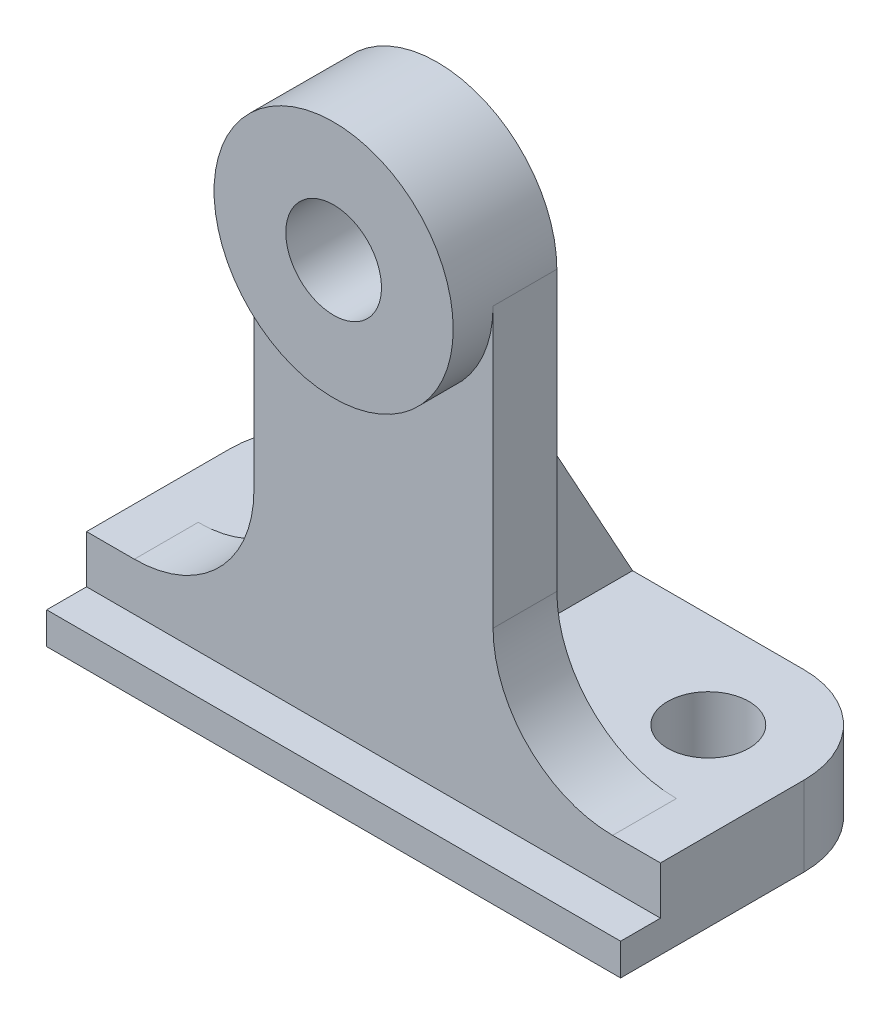
ISO-10303-21;
HEADER;
FILE_DESCRIPTION(('STEP AP214'),'2;1');
FILE_NAME('part.step','',(''),(''),'','','');
FILE_SCHEMA(('AUTOMOTIVE_DESIGN { 1 0 10303 214 1 1 1 1 }'));
ENDSEC;
DATA;
#1=APPLICATION_CONTEXT('core data for automotive mechanical design processes');
#2=APPLICATION_PROTOCOL_DEFINITION('international standard','automotive_design',2000,#1);
#3=PRODUCT_CONTEXT('',#1,'mechanical');
#4=PRODUCT('Part','Part','',(#3));
#5=PRODUCT_RELATED_PRODUCT_CATEGORY('part','',(#4));
#6=PRODUCT_DEFINITION_FORMATION('','',#4);
#7=PRODUCT_DEFINITION_CONTEXT('part definition',#1,'design');
#8=PRODUCT_DEFINITION('design','',#6,#7);
#9=PRODUCT_DEFINITION_SHAPE('','',#8);
#10=(LENGTH_UNIT() NAMED_UNIT(*) SI_UNIT(.MILLI.,.METRE.));
#11=(NAMED_UNIT(*) PLANE_ANGLE_UNIT() SI_UNIT($,.RADIAN.));
#12=(NAMED_UNIT(*) SI_UNIT($,.STERADIAN.) SOLID_ANGLE_UNIT());
#13=UNCERTAINTY_MEASURE_WITH_UNIT(LENGTH_MEASURE(1.E-05),#10,'distance_accuracy_value','');
#14=(GEOMETRIC_REPRESENTATION_CONTEXT(3) GLOBAL_UNCERTAINTY_ASSIGNED_CONTEXT((#13)) GLOBAL_UNIT_ASSIGNED_CONTEXT((#10,
#11,#12)) REPRESENTATION_CONTEXT('',''));
#15=CARTESIAN_POINT('',(0.,0.,0.));
#16=DIRECTION('',(0.,0.,1.));
#17=DIRECTION('',(1.,0.,0.));
#18=AXIS2_PLACEMENT_3D('',#15,#16,#17);
#19=CARTESIAN_POINT('',(0.,10.,8.));
#20=DIRECTION('',(0.,-1.,0.));
#21=DIRECTION('',(0.,0.,-1.));
#22=AXIS2_PLACEMENT_3D('',#19,#20,#21);
#23=PLANE('',#22);
#24=CARTESIAN_POINT('',(-24.,10.,-10.));
#25=DIRECTION('',(0.,1.,0.));
#26=DIRECTION('',(0.,0.,1.));
#27=AXIS2_PLACEMENT_3D('',#24,#25,#26);
#28=CIRCLE('',#27,5.1);
#29=CARTESIAN_POINT('',(-24.,10.,-4.9));
#30=VERTEX_POINT('',#29);
#31=EDGE_CURVE('E228',#30,#30,#28,.T.);
#32=ORIENTED_EDGE('',*,*,#31,.F.);
#33=EDGE_LOOP('',(#32));
#34=FACE_BOUND('',#33,.T.);
#35=DIRECTION('',(0.,0.,-1.));
#36=VECTOR('',#35,1.);
#37=CARTESIAN_POINT('',(-2.5,10.,0.));
#38=LINE('',#37,#36);
#39=CARTESIAN_POINT('',(-2.5,10.,0.));
#40=VERTEX_POINT('',#39);
#41=CARTESIAN_POINT('',(-2.5,10.,-22.));
#42=VERTEX_POINT('',#41);
#43=EDGE_CURVE('E81',#40,#42,#38,.T.);
#44=ORIENTED_EDGE('',*,*,#43,.T.);
#45=DIRECTION('',(1.,0.,0.));
#46=VECTOR('',#45,1.);
#47=CARTESIAN_POINT('',(36.,10.,-22.));
#48=LINE('',#47,#46);
#49=CARTESIAN_POINT('',(-23.9999999999999,10.,-22.));
#50=VERTEX_POINT('',#49);
#51=EDGE_CURVE('E253',#50,#42,#48,.T.);
#52=ORIENTED_EDGE('',*,*,#51,.F.);
#53=CARTESIAN_POINT('',(-24.,10.,-10.));
#54=DIRECTION('',(0.,1.,0.));
#55=DIRECTION('',(0.,0.,1.));
#56=AXIS2_PLACEMENT_3D('',#53,#54,#55);
#57=CIRCLE('',#56,12.);
#58=CARTESIAN_POINT('',(-36.,10.,-9.99999999999991));
#59=VERTEX_POINT('',#58);
#60=EDGE_CURVE('E223',#50,#59,#57,.T.);
#61=ORIENTED_EDGE('',*,*,#60,.T.);
#62=DIRECTION('',(0.,0.,-1.));
#63=VECTOR('',#62,1.);
#64=CARTESIAN_POINT('',(-36.,10.,8.));
#65=LINE('',#64,#63);
#66=CARTESIAN_POINT('',(-36.,10.,8.));
#67=VERTEX_POINT('',#66);
#68=EDGE_CURVE('E323',#67,#59,#65,.T.);
#69=ORIENTED_EDGE('',*,*,#68,.F.);
#70=DIRECTION('',(-1.,0.,0.));
#71=VECTOR('',#70,1.);
#72=CARTESIAN_POINT('',(0.,10.,8.));
#73=LINE('',#72,#71);
#74=CARTESIAN_POINT('',(-30.0000000000001,10.,8.));
#75=VERTEX_POINT('',#74);
#76=EDGE_CURVE('E276',#75,#67,#73,.T.);
#77=ORIENTED_EDGE('',*,*,#76,.F.);
#78=DIRECTION('',(0.,0.,-1.));
#79=VECTOR('',#78,1.);
#80=CARTESIAN_POINT('',(-30.0000000000001,10.,8.));
#81=LINE('',#80,#79);
#82=CARTESIAN_POINT('',(-30.,10.,0.));
#83=VERTEX_POINT('',#82);
#84=EDGE_CURVE('E326',#75,#83,#81,.T.);
#85=ORIENTED_EDGE('',*,*,#84,.T.);
#86=DIRECTION('',(1.,0.,0.));
#87=VECTOR('',#86,1.);
#88=CARTESIAN_POINT('',(36.,10.,0.));
#89=LINE('',#88,#87);
#90=EDGE_CURVE('E256',#83,#40,#89,.T.);
#91=ORIENTED_EDGE('',*,*,#90,.T.);
#92=EDGE_LOOP('',(#44,#52,#61,#69,#77,#85,#91));
#93=FACE_BOUND('',#92,.T.);
#94=ADVANCED_FACE('F58',(#34,#93),#23,.F.);
#95=CARTESIAN_POINT('',(0.,0.,8.));
#96=DIRECTION('',(0.,0.,1.));
#97=DIRECTION('',(1.,0.,0.));
#98=AXIS2_PLACEMENT_3D('',#95,#96,#97);
#99=PLANE('',#98);
#100=DIRECTION('',(0.,-1.,0.));
#101=VECTOR('',#100,1.);
#102=CARTESIAN_POINT('',(-36.,0.,8.));
#103=LINE('',#102,#101);
#104=CARTESIAN_POINT('',(-36.,4.,8.));
#105=VERTEX_POINT('',#104);
#106=EDGE_CURVE('E278',#67,#105,#103,.T.);
#107=ORIENTED_EDGE('',*,*,#106,.T.);
#108=DIRECTION('',(-1.,0.,0.));
#109=VECTOR('',#108,1.);
#110=CARTESIAN_POINT('',(-36.,4.,8.));
#111=LINE('',#110,#109);
#112=CARTESIAN_POINT('',(36.,4.,8.));
#113=VERTEX_POINT('',#112);
#114=EDGE_CURVE('E206',#113,#105,#111,.T.);
#115=ORIENTED_EDGE('',*,*,#114,.F.);
#116=DIRECTION('',(0.,1.,0.));
#117=VECTOR('',#116,1.);
#118=CARTESIAN_POINT('',(36.,0.,8.));
#119=LINE('',#118,#117);
#120=CARTESIAN_POINT('',(36.,10.,8.));
#121=VERTEX_POINT('',#120);
#122=EDGE_CURVE('E281',#113,#121,#119,.T.);
#123=ORIENTED_EDGE('',*,*,#122,.T.);
#124=DIRECTION('',(-1.,0.,0.));
#125=VECTOR('',#124,1.);
#126=CARTESIAN_POINT('',(0.,10.,8.));
#127=LINE('',#126,#125);
#128=CARTESIAN_POINT('',(30.0000000000001,10.,8.));
#129=VERTEX_POINT('',#128);
#130=EDGE_CURVE('E283',#121,#129,#127,.T.);
#131=ORIENTED_EDGE('',*,*,#130,.T.);
#132=CARTESIAN_POINT('',(30.,25.,8.));
#133=DIRECTION('',(0.,0.,1.));
#134=DIRECTION('',(1.,0.,0.));
#135=AXIS2_PLACEMENT_3D('',#132,#133,#134);
#136=CIRCLE('',#135,15.);
#137=CARTESIAN_POINT('',(15.,25.0000000000001,8.));
#138=VERTEX_POINT('',#137);
#139=EDGE_CURVE('E285',#138,#129,#136,.T.);
#140=ORIENTED_EDGE('',*,*,#139,.F.);
#141=DIRECTION('',(0.,-1.,0.));
#142=VECTOR('',#141,1.);
#143=CARTESIAN_POINT('',(15.,0.,8.));
#144=LINE('',#143,#142);
#145=CARTESIAN_POINT('',(15.,60.,8.));
#146=VERTEX_POINT('',#145);
#147=EDGE_CURVE('E288',#146,#138,#144,.T.);
#148=ORIENTED_EDGE('',*,*,#147,.F.);
#149=CARTESIAN_POINT('',(0.,60.,8.));
#150=DIRECTION('',(0.,0.,1.));
#151=DIRECTION('',(1.,0.,0.));
#152=AXIS2_PLACEMENT_3D('',#149,#150,#151);
#153=CIRCLE('',#152,15.);
#154=CARTESIAN_POINT('',(-15.,60.,8.));
#155=VERTEX_POINT('',#154);
#156=EDGE_CURVE('E291',#155,#146,#153,.T.);
#157=ORIENTED_EDGE('',*,*,#156,.F.);
#158=DIRECTION('',(0.,-1.,0.));
#159=VECTOR('',#158,1.);
#160=CARTESIAN_POINT('',(-15.,0.,8.));
#161=LINE('',#160,#159);
#162=CARTESIAN_POINT('',(-15.,25.0000000000001,8.));
#163=VERTEX_POINT('',#162);
#164=EDGE_CURVE('E270',#155,#163,#161,.T.);
#165=ORIENTED_EDGE('',*,*,#164,.T.);
#166=CARTESIAN_POINT('',(-30.,25.,8.));
#167=DIRECTION('',(0.,0.,1.));
#168=DIRECTION('',(1.,0.,0.));
#169=AXIS2_PLACEMENT_3D('',#166,#167,#168);
#170=CIRCLE('',#169,15.);
#171=EDGE_CURVE('E273',#163,#75,#170,.F.);
#172=ORIENTED_EDGE('',*,*,#171,.T.);
#173=ORIENTED_EDGE('',*,*,#76,.T.);
#174=EDGE_LOOP('',(#107,#115,#123,#131,#140,#148,#157,#165,#172,#173));
#175=FACE_BOUND('',#174,.T.);
#176=ADVANCED_FACE('F365',(#175),#99,.T.);
#177=CARTESIAN_POINT('',(-36.,0.,8.));
#178=DIRECTION('',(1.,0.,0.));
#179=DIRECTION('',(0.,0.,-1.));
#180=AXIS2_PLACEMENT_3D('',#177,#178,#179);
#181=PLANE('',#180);
#182=DIRECTION('',(0.,1.,0.));
#183=VECTOR('',#182,1.);
#184=CARTESIAN_POINT('',(-36.,-12.,-9.99999999999991));
#185=LINE('',#184,#183);
#186=CARTESIAN_POINT('',(-36.,0.,-9.99999999999991));
#187=VERTEX_POINT('',#186);
#188=EDGE_CURVE('E226',#187,#59,#185,.T.);
#189=ORIENTED_EDGE('',*,*,#188,.F.);
#190=DIRECTION('',(0.,0.,-1.));
#191=VECTOR('',#190,1.);
#192=CARTESIAN_POINT('',(-36.,0.,8.));
#193=LINE('',#192,#191);
#194=CARTESIAN_POINT('',(-36.,0.,13.));
#195=VERTEX_POINT('',#194);
#196=EDGE_CURVE('E320',#195,#187,#193,.T.);
#197=ORIENTED_EDGE('',*,*,#196,.F.);
#198=DIRECTION('',(0.,-1.,0.));
#199=VECTOR('',#198,1.);
#200=CARTESIAN_POINT('',(-36.,0.,13.));
#201=LINE('',#200,#199);
#202=CARTESIAN_POINT('',(-36.,4.,13.));
#203=VERTEX_POINT('',#202);
#204=EDGE_CURVE('E207',#203,#195,#201,.T.);
#205=ORIENTED_EDGE('',*,*,#204,.F.);
#206=DIRECTION('',(0.,0.,-1.));
#207=VECTOR('',#206,1.);
#208=CARTESIAN_POINT('',(-36.,4.,13.));
#209=LINE('',#208,#207);
#210=EDGE_CURVE('E217',#203,#105,#209,.T.);
#211=ORIENTED_EDGE('',*,*,#210,.T.);
#212=ORIENTED_EDGE('',*,*,#106,.F.);
#213=ORIENTED_EDGE('',*,*,#68,.T.);
#214=EDGE_LOOP('',(#189,#197,#205,#211,#212,#213));
#215=FACE_BOUND('',#214,.T.);
#216=ADVANCED_FACE('F346',(#215),#181,.F.);
#217=CARTESIAN_POINT('',(0.,0.,8.));
#218=DIRECTION('',(0.,1.,0.));
#219=DIRECTION('',(0.,0.,1.));
#220=AXIS2_PLACEMENT_3D('',#217,#218,#219);
#221=PLANE('',#220);
#222=CARTESIAN_POINT('',(-24.,0.,-10.));
#223=DIRECTION('',(0.,1.,0.));
#224=DIRECTION('',(0.,0.,1.));
#225=AXIS2_PLACEMENT_3D('',#222,#223,#224);
#226=CIRCLE('',#225,5.1);
#227=CARTESIAN_POINT('',(-24.,0.,-4.9));
#228=VERTEX_POINT('',#227);
#229=EDGE_CURVE('E244',#228,#228,#226,.T.);
#230=ORIENTED_EDGE('',*,*,#229,.T.);
#231=EDGE_LOOP('',(#230));
#232=FACE_BOUND('',#231,.T.);
#233=CARTESIAN_POINT('',(-24.,0.,-10.));
#234=DIRECTION('',(0.,1.,0.));
#235=DIRECTION('',(0.,0.,1.));
#236=AXIS2_PLACEMENT_3D('',#233,#234,#235);
#237=CIRCLE('',#236,12.);
#238=CARTESIAN_POINT('',(-23.9999999999999,0.,-22.));
#239=VERTEX_POINT('',#238);
#240=EDGE_CURVE('E242',#239,#187,#237,.T.);
#241=ORIENTED_EDGE('',*,*,#240,.F.);
#242=DIRECTION('',(-1.,0.,0.));
#243=VECTOR('',#242,1.);
#244=CARTESIAN_POINT('',(36.,0.,-22.));
#245=LINE('',#244,#243);
#246=CARTESIAN_POINT('',(24.,0.,-22.));
#247=VERTEX_POINT('',#246);
#248=EDGE_CURVE('E250',#247,#239,#245,.T.);
#249=ORIENTED_EDGE('',*,*,#248,.F.);
#250=CARTESIAN_POINT('',(24.,0.,-10.));
#251=DIRECTION('',(0.,1.,0.));
#252=DIRECTION('',(0.,0.,1.));
#253=AXIS2_PLACEMENT_3D('',#250,#251,#252);
#254=CIRCLE('',#253,12.);
#255=CARTESIAN_POINT('',(36.,0.,-9.99999999999991));
#256=VERTEX_POINT('',#255);
#257=EDGE_CURVE('E239',#247,#256,#254,.F.);
#258=ORIENTED_EDGE('',*,*,#257,.T.);
#259=DIRECTION('',(0.,0.,-1.));
#260=VECTOR('',#259,1.);
#261=CARTESIAN_POINT('',(36.,0.,8.));
#262=LINE('',#261,#260);
#263=CARTESIAN_POINT('',(36.,0.,13.));
#264=VERTEX_POINT('',#263);
#265=EDGE_CURVE('E317',#264,#256,#262,.T.);
#266=ORIENTED_EDGE('',*,*,#265,.F.);
#267=DIRECTION('',(1.,0.,0.));
#268=VECTOR('',#267,1.);
#269=CARTESIAN_POINT('',(-36.,0.,13.));
#270=LINE('',#269,#268);
#271=EDGE_CURVE('E210',#195,#264,#270,.T.);
#272=ORIENTED_EDGE('',*,*,#271,.F.);
#273=ORIENTED_EDGE('',*,*,#196,.T.);
#274=EDGE_LOOP('',(#241,#249,#258,#266,#272,#273));
#275=FACE_BOUND('',#274,.T.);
#276=CARTESIAN_POINT('',(24.,0.,-10.));
#277=DIRECTION('',(0.,1.,0.));
#278=DIRECTION('',(0.,0.,1.));
#279=AXIS2_PLACEMENT_3D('',#276,#277,#278);
#280=CIRCLE('',#279,5.1);
#281=CARTESIAN_POINT('',(24.,0.,-4.9));
#282=VERTEX_POINT('',#281);
#283=EDGE_CURVE('E247',#282,#282,#280,.T.);
#284=ORIENTED_EDGE('',*,*,#283,.T.);
#285=EDGE_LOOP('',(#284));
#286=FACE_BOUND('',#285,.T.);
#287=ADVANCED_FACE('F339',(#232,#275,#286),#221,.F.);
#288=CARTESIAN_POINT('',(36.,0.,8.));
#289=DIRECTION('',(-1.,0.,0.));
#290=DIRECTION('',(0.,0.,1.));
#291=AXIS2_PLACEMENT_3D('',#288,#289,#290);
#292=PLANE('',#291);
#293=DIRECTION('',(0.,1.,0.));
#294=VECTOR('',#293,1.);
#295=CARTESIAN_POINT('',(36.,-12.,-9.99999999999991));
#296=LINE('',#295,#294);
#297=CARTESIAN_POINT('',(36.,10.,-9.99999999999991));
#298=VERTEX_POINT('',#297);
#299=EDGE_CURVE('E236',#256,#298,#296,.T.);
#300=ORIENTED_EDGE('',*,*,#299,.T.);
#301=DIRECTION('',(0.,0.,-1.));
#302=VECTOR('',#301,1.);
#303=CARTESIAN_POINT('',(36.,10.,8.));
#304=LINE('',#303,#302);
#305=EDGE_CURVE('E314',#121,#298,#304,.T.);
#306=ORIENTED_EDGE('',*,*,#305,.F.);
#307=ORIENTED_EDGE('',*,*,#122,.F.);
#308=DIRECTION('',(0.,0.,-1.));
#309=VECTOR('',#308,1.);
#310=CARTESIAN_POINT('',(36.,4.,13.));
#311=LINE('',#310,#309);
#312=CARTESIAN_POINT('',(36.,4.,13.));
#313=VERTEX_POINT('',#312);
#314=EDGE_CURVE('E221',#313,#113,#311,.T.);
#315=ORIENTED_EDGE('',*,*,#314,.F.);
#316=DIRECTION('',(0.,1.,0.));
#317=VECTOR('',#316,1.);
#318=CARTESIAN_POINT('',(36.,0.,13.));
#319=LINE('',#318,#317);
#320=EDGE_CURVE('E213',#264,#313,#319,.T.);
#321=ORIENTED_EDGE('',*,*,#320,.F.);
#322=ORIENTED_EDGE('',*,*,#265,.T.);
#323=EDGE_LOOP('',(#300,#306,#307,#315,#321,#322));
#324=FACE_BOUND('',#323,.T.);
#325=ADVANCED_FACE('F371',(#324),#292,.F.);
#326=CARTESIAN_POINT('',(2.5,10.,-22.));
#327=VERTEX_POINT('',#326);
#328=CARTESIAN_POINT('',(23.9999999999999,10.,-22.));
#329=VERTEX_POINT('',#328);
#330=EDGE_CURVE('E73',#327,#329,#48,.T.);
#331=ORIENTED_EDGE('',*,*,#330,.F.);
#332=DIRECTION('',(0.,0.,-1.));
#333=VECTOR('',#332,1.);
#334=CARTESIAN_POINT('',(2.5,10.,0.));
#335=LINE('',#334,#333);
#336=CARTESIAN_POINT('',(2.5,10.,0.));
#337=VERTEX_POINT('',#336);
#338=EDGE_CURVE('E198',#337,#327,#335,.T.);
#339=ORIENTED_EDGE('',*,*,#338,.F.);
#340=CARTESIAN_POINT('',(30.0000000000001,10.,0.));
#341=VERTEX_POINT('',#340);
#342=EDGE_CURVE('E258',#337,#341,#89,.T.);
#343=ORIENTED_EDGE('',*,*,#342,.T.);
#344=DIRECTION('',(0.,0.,-1.));
#345=VECTOR('',#344,1.);
#346=CARTESIAN_POINT('',(30.0000000000001,10.,8.));
#347=LINE('',#346,#345);
#348=EDGE_CURVE('E311',#129,#341,#347,.T.);
#349=ORIENTED_EDGE('',*,*,#348,.F.);
#350=ORIENTED_EDGE('',*,*,#130,.F.);
#351=ORIENTED_EDGE('',*,*,#305,.T.);
#352=CARTESIAN_POINT('',(24.,10.,-10.));
#353=DIRECTION('',(0.,1.,0.));
#354=DIRECTION('',(0.,0.,1.));
#355=AXIS2_PLACEMENT_3D('',#352,#353,#354);
#356=CIRCLE('',#355,12.);
#357=EDGE_CURVE('E232',#329,#298,#356,.F.);
#358=ORIENTED_EDGE('',*,*,#357,.F.);
#359=EDGE_LOOP('',(#331,#339,#343,#349,#350,#351,#358));
#360=FACE_BOUND('',#359,.T.);
#361=CARTESIAN_POINT('',(24.,10.,-10.));
#362=DIRECTION('',(0.,1.,0.));
#363=DIRECTION('',(0.,0.,1.));
#364=AXIS2_PLACEMENT_3D('',#361,#362,#363);
#365=CIRCLE('',#364,5.1);
#366=CARTESIAN_POINT('',(24.,10.,-4.9));
#367=VERTEX_POINT('',#366);
#368=EDGE_CURVE('E229',#367,#367,#365,.T.);
#369=ORIENTED_EDGE('',*,*,#368,.F.);
#370=EDGE_LOOP('',(#369));
#371=FACE_BOUND('',#370,.T.);
#372=ADVANCED_FACE('F354',(#360,#371),#23,.F.);
#373=CARTESIAN_POINT('',(0.,0.,-22.));
#374=DIRECTION('',(0.,0.,-1.));
#375=DIRECTION('',(-1.,0.,0.));
#376=AXIS2_PLACEMENT_3D('',#373,#374,#375);
#377=PLANE('',#376);
#378=ORIENTED_EDGE('',*,*,#248,.T.);
#379=DIRECTION('',(0.,1.,0.));
#380=VECTOR('',#379,1.);
#381=CARTESIAN_POINT('',(-24.,-12.,-22.));
#382=LINE('',#381,#380);
#383=EDGE_CURVE('E12',#239,#50,#382,.T.);
#384=ORIENTED_EDGE('',*,*,#383,.T.);
#385=ORIENTED_EDGE('',*,*,#51,.T.);
#386=DIRECTION('',(-1.,0.,0.));
#387=VECTOR('',#386,1.);
#388=CARTESIAN_POINT('',(2.5,10.,-22.));
#389=LINE('',#388,#387);
#390=EDGE_CURVE('E189',#327,#42,#389,.T.);
#391=ORIENTED_EDGE('',*,*,#390,.F.);
#392=ORIENTED_EDGE('',*,*,#330,.T.);
#393=DIRECTION('',(0.,1.,0.));
#394=VECTOR('',#393,1.);
#395=CARTESIAN_POINT('',(24.,-12.,-22.));
#396=LINE('',#395,#394);
#397=EDGE_CURVE('E66',#329,#247,#396,.F.);
#398=ORIENTED_EDGE('',*,*,#397,.T.);
#399=EDGE_LOOP('',(#378,#384,#385,#391,#392,#398));
#400=FACE_BOUND('',#399,.T.);
#401=ADVANCED_FACE('F335',(#400),#377,.T.);
#402=CARTESIAN_POINT('',(0.,0.,0.));
#403=DIRECTION('',(0.,0.,1.));
#404=DIRECTION('',(1.,0.,0.));
#405=AXIS2_PLACEMENT_3D('',#402,#403,#404);
#406=PLANE('',#405);
#407=CARTESIAN_POINT('',(0.,60.,0.));
#408=DIRECTION('',(0.,0.,1.));
#409=DIRECTION('',(1.,0.,0.));
#410=AXIS2_PLACEMENT_3D('',#407,#408,#409);
#411=CIRCLE('',#410,6.);
#412=CARTESIAN_POINT('',(-6.,60.,0.));
#413=VERTEX_POINT('',#412);
#414=EDGE_CURVE('E255',#413,#413,#411,.T.);
#415=ORIENTED_EDGE('',*,*,#414,.T.);
#416=EDGE_LOOP('',(#415));
#417=FACE_BOUND('',#416,.T.);
#418=ORIENTED_EDGE('',*,*,#342,.F.);
#419=DIRECTION('',(0.,-1.,0.));
#420=VECTOR('',#419,1.);
#421=CARTESIAN_POINT('',(2.5,10.,0.));
#422=LINE('',#421,#420);
#423=CARTESIAN_POINT('',(2.5,50.,0.));
#424=VERTEX_POINT('',#423);
#425=EDGE_CURVE('E185',#424,#337,#422,.T.);
#426=ORIENTED_EDGE('',*,*,#425,.F.);
#427=DIRECTION('',(-1.,0.,0.));
#428=VECTOR('',#427,1.);
#429=CARTESIAN_POINT('',(2.5,50.,0.));
#430=LINE('',#429,#428);
#431=CARTESIAN_POINT('',(-2.5,50.,0.));
#432=VERTEX_POINT('',#431);
#433=EDGE_CURVE('E178',#424,#432,#430,.T.);
#434=ORIENTED_EDGE('',*,*,#433,.T.);
#435=DIRECTION('',(0.,-1.,0.));
#436=VECTOR('',#435,1.);
#437=CARTESIAN_POINT('',(-2.5,10.,0.));
#438=LINE('',#437,#436);
#439=EDGE_CURVE('E183',#432,#40,#438,.T.);
#440=ORIENTED_EDGE('',*,*,#439,.T.);
#441=ORIENTED_EDGE('',*,*,#90,.F.);
#442=CARTESIAN_POINT('',(-30.,25.,0.));
#443=DIRECTION('',(0.,0.,1.));
#444=DIRECTION('',(1.,0.,0.));
#445=AXIS2_PLACEMENT_3D('',#442,#443,#444);
#446=CIRCLE('',#445,15.);
#447=CARTESIAN_POINT('',(-15.,25.0000000000001,0.));
#448=VERTEX_POINT('',#447);
#449=EDGE_CURVE('E296',#448,#83,#446,.F.);
#450=ORIENTED_EDGE('',*,*,#449,.F.);
#451=DIRECTION('',(0.,-1.,0.));
#452=VECTOR('',#451,1.);
#453=CARTESIAN_POINT('',(-15.,0.,0.));
#454=LINE('',#453,#452);
#455=CARTESIAN_POINT('',(-15.,60.,0.));
#456=VERTEX_POINT('',#455);
#457=EDGE_CURVE('E266',#456,#448,#454,.T.);
#458=ORIENTED_EDGE('',*,*,#457,.F.);
#459=CARTESIAN_POINT('',(0.,60.,0.));
#460=DIRECTION('',(0.,0.,1.));
#461=DIRECTION('',(1.,0.,0.));
#462=AXIS2_PLACEMENT_3D('',#459,#460,#461);
#463=CIRCLE('',#462,15.);
#464=CARTESIAN_POINT('',(15.,60.,0.));
#465=VERTEX_POINT('',#464);
#466=EDGE_CURVE('E263',#465,#456,#463,.T.);
#467=ORIENTED_EDGE('',*,*,#466,.F.);
#468=DIRECTION('',(0.,-1.,0.));
#469=VECTOR('',#468,1.);
#470=CARTESIAN_POINT('',(15.,0.,0.));
#471=LINE('',#470,#469);
#472=CARTESIAN_POINT('',(15.,25.0000000000001,0.));
#473=VERTEX_POINT('',#472);
#474=EDGE_CURVE('E274',#465,#473,#471,.T.);
#475=ORIENTED_EDGE('',*,*,#474,.T.);
#476=CARTESIAN_POINT('',(30.,25.,0.));
#477=DIRECTION('',(0.,0.,1.));
#478=DIRECTION('',(1.,0.,0.));
#479=AXIS2_PLACEMENT_3D('',#476,#477,#478);
#480=CIRCLE('',#479,15.);
#481=EDGE_CURVE('E299',#473,#341,#480,.T.);
#482=ORIENTED_EDGE('',*,*,#481,.T.);
#483=EDGE_LOOP('',(#418,#426,#434,#440,#441,#450,#458,#467,#475,#482));
#484=FACE_BOUND('',#483,.T.);
#485=ADVANCED_FACE('F181',(#417,#484),#406,.F.);
#486=CARTESIAN_POINT('',(-15.,0.,8.));
#487=DIRECTION('',(1.,0.,0.));
#488=DIRECTION('',(0.,0.,-1.));
#489=AXIS2_PLACEMENT_3D('',#486,#487,#488);
#490=PLANE('',#489);
#491=ORIENTED_EDGE('',*,*,#457,.T.);
#492=DIRECTION('',(0.,0.,-1.));
#493=VECTOR('',#492,1.);
#494=CARTESIAN_POINT('',(-15.,25.0000000000001,8.));
#495=LINE('',#494,#493);
#496=EDGE_CURVE('E329',#163,#448,#495,.T.);
#497=ORIENTED_EDGE('',*,*,#496,.F.);
#498=ORIENTED_EDGE('',*,*,#164,.F.);
#499=DIRECTION('',(0.,0.,-1.));
#500=VECTOR('',#499,1.);
#501=CARTESIAN_POINT('',(-15.,60.,8.));
#502=LINE('',#501,#500);
#503=EDGE_CURVE('E293',#155,#456,#502,.T.);
#504=ORIENTED_EDGE('',*,*,#503,.T.);
#505=EDGE_LOOP('',(#491,#497,#498,#504));
#506=FACE_BOUND('',#505,.T.);
#507=ADVANCED_FACE('F60',(#506),#490,.F.);
#508=CARTESIAN_POINT('',(-30.,25.,8.));
#509=DIRECTION('',(0.,0.,-1.));
#510=DIRECTION('',(-1.,0.,0.));
#511=AXIS2_PLACEMENT_3D('',#508,#509,#510);
#512=CYLINDRICAL_SURFACE('',#511,15.);
#513=ORIENTED_EDGE('',*,*,#449,.T.);
#514=ORIENTED_EDGE('',*,*,#84,.F.);
#515=ORIENTED_EDGE('',*,*,#171,.F.);
#516=ORIENTED_EDGE('',*,*,#496,.T.);
#517=EDGE_LOOP('',(#513,#514,#515,#516));
#518=FACE_BOUND('',#517,.T.);
#519=ADVANCED_FACE('F410',(#518),#512,.F.);
#520=CARTESIAN_POINT('',(30.,25.,8.));
#521=DIRECTION('',(0.,0.,-1.));
#522=DIRECTION('',(-1.,0.,0.));
#523=AXIS2_PLACEMENT_3D('',#520,#521,#522);
#524=CYLINDRICAL_SURFACE('',#523,15.);
#525=ORIENTED_EDGE('',*,*,#481,.F.);
#526=DIRECTION('',(0.,0.,-1.));
#527=VECTOR('',#526,1.);
#528=CARTESIAN_POINT('',(15.,25.0000000000001,8.));
#529=LINE('',#528,#527);
#530=EDGE_CURVE('E309',#138,#473,#529,.T.);
#531=ORIENTED_EDGE('',*,*,#530,.F.);
#532=ORIENTED_EDGE('',*,*,#139,.T.);
#533=ORIENTED_EDGE('',*,*,#348,.T.);
#534=EDGE_LOOP('',(#525,#531,#532,#533));
#535=FACE_BOUND('',#534,.T.);
#536=ADVANCED_FACE('F360',(#535),#524,.F.);
#537=CARTESIAN_POINT('',(15.,0.,8.));
#538=DIRECTION('',(1.,0.,0.));
#539=DIRECTION('',(0.,0.,-1.));
#540=AXIS2_PLACEMENT_3D('',#537,#538,#539);
#541=PLANE('',#540);
#542=ORIENTED_EDGE('',*,*,#474,.F.);
#543=DIRECTION('',(0.,0.,-1.));
#544=VECTOR('',#543,1.);
#545=CARTESIAN_POINT('',(15.,60.,8.));
#546=LINE('',#545,#544);
#547=EDGE_CURVE('E306',#146,#465,#546,.T.);
#548=ORIENTED_EDGE('',*,*,#547,.F.);
#549=ORIENTED_EDGE('',*,*,#147,.T.);
#550=ORIENTED_EDGE('',*,*,#530,.T.);
#551=EDGE_LOOP('',(#542,#548,#549,#550));
#552=FACE_BOUND('',#551,.T.);
#553=ADVANCED_FACE('F417',(#552),#541,.T.);
#554=CARTESIAN_POINT('',(0.,60.,13.));
#555=DIRECTION('',(0.,0.,-1.));
#556=DIRECTION('',(-1.,0.,0.));
#557=AXIS2_PLACEMENT_3D('',#554,#555,#556);
#558=CYLINDRICAL_SURFACE('',#557,15.);
#559=CARTESIAN_POINT('',(0.,60.,13.));
#560=DIRECTION('',(0.,0.,1.));
#561=DIRECTION('',(1.,0.,0.));
#562=AXIS2_PLACEMENT_3D('',#559,#560,#561);
#563=CIRCLE('',#562,15.);
#564=CARTESIAN_POINT('',(15.,60.,13.));
#565=VERTEX_POINT('',#564);
#566=EDGE_CURVE('E262',#565,#565,#563,.T.);
#567=ORIENTED_EDGE('',*,*,#566,.F.);
#568=EDGE_LOOP('',(#567));
#569=FACE_BOUND('',#568,.T.);
#570=ORIENTED_EDGE('',*,*,#466,.T.);
#571=ORIENTED_EDGE('',*,*,#503,.F.);
#572=ORIENTED_EDGE('',*,*,#156,.T.);
#573=ORIENTED_EDGE('',*,*,#547,.T.);
#574=EDGE_LOOP('',(#570,#571,#572,#573));
#575=FACE_BOUND('',#574,.T.);
#576=ADVANCED_FACE('F425',(#569,#575),#558,.T.);
#577=CARTESIAN_POINT('',(0.,60.,13.));
#578=DIRECTION('',(0.,0.,-1.));
#579=DIRECTION('',(-1.,0.,0.));
#580=AXIS2_PLACEMENT_3D('',#577,#578,#579);
#581=CYLINDRICAL_SURFACE('',#580,6.);
#582=CARTESIAN_POINT('',(0.,60.,13.));
#583=DIRECTION('',(0.,0.,1.));
#584=DIRECTION('',(1.,0.,0.));
#585=AXIS2_PLACEMENT_3D('',#582,#583,#584);
#586=CIRCLE('',#585,6.);
#587=CARTESIAN_POINT('',(-6.,60.,13.));
#588=VERTEX_POINT('',#587);
#589=EDGE_CURVE('E259',#588,#588,#586,.T.);
#590=CARTESIAN_POINT('',(-6.,60.,13.));
#591=CARTESIAN_POINT('',(-6.,60.,12.8645833333333));
#592=CARTESIAN_POINT('',(-6.,60.,12.7291666666667));
#593=CARTESIAN_POINT('',(-6.,60.,12.4583333333333));
#594=CARTESIAN_POINT('',(-6.,60.,12.3229166666667));
#595=CARTESIAN_POINT('',(-6.,60.,12.0520833333333));
#596=CARTESIAN_POINT('',(-6.,60.,11.9166666666667));
#597=CARTESIAN_POINT('',(-6.,60.,11.6458333333333));
#598=CARTESIAN_POINT('',(-6.,60.,11.5104166666667));
#599=CARTESIAN_POINT('',(-6.,60.,11.2395833333333));
#600=CARTESIAN_POINT('',(-6.,60.,11.1041666666667));
#601=CARTESIAN_POINT('',(-6.,60.,10.8333333333333));
#602=CARTESIAN_POINT('',(-6.,60.,10.6979166666667));
#603=CARTESIAN_POINT('',(-6.,60.,10.4270833333333));
#604=CARTESIAN_POINT('',(-6.,60.,10.2916666666667));
#605=CARTESIAN_POINT('',(-6.,60.,10.0208333333333));
#606=CARTESIAN_POINT('',(-6.,60.,9.88541666666667));
#607=CARTESIAN_POINT('',(-6.,60.,9.61458333333333));
#608=CARTESIAN_POINT('',(-6.,60.,9.47916666666667));
#609=CARTESIAN_POINT('',(-6.,60.,9.20833333333333));
#610=CARTESIAN_POINT('',(-6.,60.,9.07291666666666));
#611=CARTESIAN_POINT('',(-6.,60.,8.80208333333333));
#612=CARTESIAN_POINT('',(-6.,60.,8.66666666666667));
#613=CARTESIAN_POINT('',(-6.,60.,8.39583333333333));
#614=CARTESIAN_POINT('',(-6.,60.,8.26041666666667));
#615=CARTESIAN_POINT('',(-6.,60.,7.98958333333333));
#616=CARTESIAN_POINT('',(-6.,60.,7.85416666666667));
#617=CARTESIAN_POINT('',(-6.,60.,7.58333333333333));
#618=CARTESIAN_POINT('',(-6.,60.,7.44791666666667));
#619=CARTESIAN_POINT('',(-6.,60.,7.17708333333333));
#620=CARTESIAN_POINT('',(-6.,60.,7.04166666666667));
#621=CARTESIAN_POINT('',(-6.,60.,6.77083333333333));
#622=CARTESIAN_POINT('',(-6.,60.,6.63541666666667));
#623=CARTESIAN_POINT('',(-6.,60.,6.36458333333333));
#624=CARTESIAN_POINT('',(-6.,60.,6.22916666666667));
#625=CARTESIAN_POINT('',(-6.,60.,5.95833333333333));
#626=CARTESIAN_POINT('',(-6.,60.,5.82291666666667));
#627=CARTESIAN_POINT('',(-6.,60.,5.55208333333333));
#628=CARTESIAN_POINT('',(-6.,60.,5.41666666666667));
#629=CARTESIAN_POINT('',(-6.,60.,5.14583333333333));
#630=CARTESIAN_POINT('',(-6.,60.,5.01041666666667));
#631=CARTESIAN_POINT('',(-6.,60.,4.73958333333333));
#632=CARTESIAN_POINT('',(-6.,60.,4.60416666666667));
#633=CARTESIAN_POINT('',(-6.,60.,4.33333333333333));
#634=CARTESIAN_POINT('',(-6.,60.,4.19791666666667));
#635=CARTESIAN_POINT('',(-6.,60.,3.92708333333333));
#636=CARTESIAN_POINT('',(-6.,60.,3.79166666666667));
#637=CARTESIAN_POINT('',(-6.,60.,3.52083333333333));
#638=CARTESIAN_POINT('',(-6.,60.,3.38541666666667));
#639=CARTESIAN_POINT('',(-6.,60.,3.11458333333333));
#640=CARTESIAN_POINT('',(-6.,60.,2.97916666666667));
#641=CARTESIAN_POINT('',(-6.,60.,2.70833333333333));
#642=CARTESIAN_POINT('',(-6.,60.,2.57291666666667));
#643=CARTESIAN_POINT('',(-6.,60.,2.30208333333333));
#644=CARTESIAN_POINT('',(-6.,60.,2.16666666666667));
#645=CARTESIAN_POINT('',(-6.,60.,1.89583333333333));
#646=CARTESIAN_POINT('',(-6.,60.,1.76041666666667));
#647=CARTESIAN_POINT('',(-6.,60.,1.48958333333333));
#648=CARTESIAN_POINT('',(-6.,60.,1.35416666666667));
#649=CARTESIAN_POINT('',(-6.,60.,1.08333333333333));
#650=CARTESIAN_POINT('',(-6.,60.,0.947916666666667));
#651=CARTESIAN_POINT('',(-6.,60.,0.677083333333334));
#652=CARTESIAN_POINT('',(-6.,60.,0.541666666666667));
#653=CARTESIAN_POINT('',(-6.,60.,0.270833333333334));
#654=CARTESIAN_POINT('',(-6.,60.,0.135416666666667));
#655=CARTESIAN_POINT('',(-6.,60.,0.));
#656=B_SPLINE_CURVE_WITH_KNOTS('',3,(#590,#591,#592,#593,#594,#595,#596,#597,#598,#599,#600,
#601,#602,#603,#604,#605,#606,#607,#608,#609,#610,#611,#612,#613,#614,#615,#616,#617,#618,#619,
#620,#621,#622,#623,#624,#625,#626,#627,#628,#629,#630,#631,#632,#633,#634,#635,#636,#637,#638,
#639,#640,#641,#642,#643,#644,#645,#646,#647,#648,#649,#650,#651,#652,#653,#654,#655),
.UNSPECIFIED.,.F.,.F.,(4,2,2,2,2,2,2,2,2,2,2,2,2,2,2,2,2,2,2,2,2,2,2,2,2,2,2,2,2,2,2,2,4),(0.,
0.40625,0.812500000000001,1.21875,1.625,2.03125,2.4375,2.84375,3.25,3.65625,4.0625,4.46875,
4.875,5.28125,5.6875,6.09375,6.5,6.90625,7.3125,7.71875,8.125,8.53125,8.9375,9.34375,9.75,
10.15625,10.5625,10.96875,11.375,11.78125,12.1875,12.59375,13.),.UNSPECIFIED.);
#657=EDGE_CURVE('BSEAM383',#588,#413,#656,.T.);
#658=ORIENTED_EDGE('',*,*,#589,.T.);
#659=ORIENTED_EDGE('',*,*,#414,.F.);
#660=ORIENTED_EDGE('',*,*,#657,.T.);
#661=ORIENTED_EDGE('',*,*,#657,.F.);
#662=EDGE_LOOP('',(#658,#660,#659,#661));
#663=FACE_BOUND('',#662,.T.);
#664=ADVANCED_FACE('F383',(#663),#581,.F.);
#665=CARTESIAN_POINT('',(0.,0.,13.));
#666=DIRECTION('',(0.,0.,1.));
#667=DIRECTION('',(1.,0.,0.));
#668=AXIS2_PLACEMENT_3D('',#665,#666,#667);
#669=PLANE('',#668);
#670=ORIENTED_EDGE('',*,*,#589,.F.);
#671=EDGE_LOOP('',(#670));
#672=FACE_BOUND('',#671,.T.);
#673=ORIENTED_EDGE('',*,*,#566,.T.);
#674=EDGE_LOOP('',(#673));
#675=FACE_BOUND('',#674,.T.);
#676=ADVANCED_FACE('F375',(#672,#675),#669,.T.);
#677=CARTESIAN_POINT('',(24.,-12.,-10.));
#678=DIRECTION('',(0.,1.,0.));
#679=DIRECTION('',(0.,0.,1.));
#680=AXIS2_PLACEMENT_3D('',#677,#678,#679);
#681=CYLINDRICAL_SURFACE('',#680,12.);
#682=ORIENTED_EDGE('',*,*,#397,.F.);
#683=ORIENTED_EDGE('',*,*,#357,.T.);
#684=ORIENTED_EDGE('',*,*,#299,.F.);
#685=ORIENTED_EDGE('',*,*,#257,.F.);
#686=EDGE_LOOP('',(#682,#683,#684,#685));
#687=FACE_BOUND('',#686,.T.);
#688=ADVANCED_FACE('F373',(#687),#681,.T.);
#689=CARTESIAN_POINT('',(-24.,-12.,-10.));
#690=DIRECTION('',(0.,1.,0.));
#691=DIRECTION('',(0.,0.,1.));
#692=AXIS2_PLACEMENT_3D('',#689,#690,#691);
#693=CYLINDRICAL_SURFACE('',#692,12.);
#694=ORIENTED_EDGE('',*,*,#240,.T.);
#695=ORIENTED_EDGE('',*,*,#188,.T.);
#696=ORIENTED_EDGE('',*,*,#60,.F.);
#697=ORIENTED_EDGE('',*,*,#383,.F.);
#698=EDGE_LOOP('',(#694,#695,#696,#697));
#699=FACE_BOUND('',#698,.T.);
#700=ADVANCED_FACE('F344',(#699),#693,.T.);
#701=CARTESIAN_POINT('',(-24.,-12.,-10.));
#702=DIRECTION('',(0.,1.,0.));
#703=DIRECTION('',(0.,0.,1.));
#704=AXIS2_PLACEMENT_3D('',#701,#702,#703);
#705=CYLINDRICAL_SURFACE('',#704,5.1);
#706=ORIENTED_EDGE('',*,*,#31,.T.);
#707=EDGE_LOOP('',(#706));
#708=FACE_BOUND('',#707,.T.);
#709=ORIENTED_EDGE('',*,*,#229,.F.);
#710=EDGE_LOOP('',(#709));
#711=FACE_BOUND('',#710,.T.);
#712=ADVANCED_FACE('F381',(#708,#711),#705,.F.);
#713=CARTESIAN_POINT('',(24.,-12.,-10.));
#714=DIRECTION('',(0.,1.,0.));
#715=DIRECTION('',(0.,0.,1.));
#716=AXIS2_PLACEMENT_3D('',#713,#714,#715);
#717=CYLINDRICAL_SURFACE('',#716,5.1);
#718=ORIENTED_EDGE('',*,*,#368,.T.);
#719=EDGE_LOOP('',(#718));
#720=FACE_BOUND('',#719,.T.);
#721=ORIENTED_EDGE('',*,*,#283,.F.);
#722=EDGE_LOOP('',(#721));
#723=FACE_BOUND('',#722,.T.);
#724=ADVANCED_FACE('F487',(#720,#723),#717,.F.);
#725=CARTESIAN_POINT('',(-36.,4.,13.));
#726=DIRECTION('',(0.,-1.,0.));
#727=DIRECTION('',(0.,0.,-1.));
#728=AXIS2_PLACEMENT_3D('',#725,#726,#727);
#729=PLANE('',#728);
#730=ORIENTED_EDGE('',*,*,#114,.T.);
#731=ORIENTED_EDGE('',*,*,#210,.F.);
#732=DIRECTION('',(-1.,0.,0.));
#733=VECTOR('',#732,1.);
#734=CARTESIAN_POINT('',(-36.,4.,13.));
#735=LINE('',#734,#733);
#736=EDGE_CURVE('E215',#313,#203,#735,.T.);
#737=ORIENTED_EDGE('',*,*,#736,.F.);
#738=ORIENTED_EDGE('',*,*,#314,.T.);
#739=EDGE_LOOP('',(#730,#731,#737,#738));
#740=FACE_BOUND('',#739,.T.);
#741=ADVANCED_FACE('F496',(#740),#729,.F.);
#742=CARTESIAN_POINT('',(0.,0.,13.));
#743=DIRECTION('',(0.,0.,-1.));
#744=DIRECTION('',(-1.,0.,0.));
#745=AXIS2_PLACEMENT_3D('',#742,#743,#744);
#746=PLANE('',#745);
#747=ORIENTED_EDGE('',*,*,#204,.T.);
#748=ORIENTED_EDGE('',*,*,#271,.T.);
#749=ORIENTED_EDGE('',*,*,#320,.T.);
#750=ORIENTED_EDGE('',*,*,#736,.T.);
#751=EDGE_LOOP('',(#747,#748,#749,#750));
#752=FACE_BOUND('',#751,.T.);
#753=ADVANCED_FACE('F530',(#752),#746,.F.);
#754=CARTESIAN_POINT('',(2.5,50.,0.));
#755=DIRECTION('',(0.,-0.481918749772156,0.876215908676647));
#756=DIRECTION('',(0.,-0.876215908676647,-0.481918749772156));
#757=AXIS2_PLACEMENT_3D('',#754,#755,#756);
#758=PLANE('',#757);
#759=DIRECTION('',(0.,0.876215908676647,0.481918749772156));
#760=VECTOR('',#759,1.);
#761=CARTESIAN_POINT('',(-2.5,50.,0.));
#762=LINE('',#761,#760);
#763=EDGE_CURVE('E193',#42,#432,#762,.T.);
#764=ORIENTED_EDGE('',*,*,#763,.T.);
#765=ORIENTED_EDGE('',*,*,#433,.F.);
#766=DIRECTION('',(0.,0.876215908676647,0.481918749772156));
#767=VECTOR('',#766,1.);
#768=CARTESIAN_POINT('',(2.5,50.,0.));
#769=LINE('',#768,#767);
#770=EDGE_CURVE('E201',#327,#424,#769,.T.);
#771=ORIENTED_EDGE('',*,*,#770,.F.);
#772=ORIENTED_EDGE('',*,*,#390,.T.);
#773=EDGE_LOOP('',(#764,#765,#771,#772));
#774=FACE_BOUND('',#773,.T.);
#775=ADVANCED_FACE('F194',(#774),#758,.F.);
#776=CARTESIAN_POINT('',(2.5,0.,0.));
#777=DIRECTION('',(1.,0.,0.));
#778=DIRECTION('',(0.,0.,-1.));
#779=AXIS2_PLACEMENT_3D('',#776,#777,#778);
#780=PLANE('',#779);
#781=ORIENTED_EDGE('',*,*,#338,.T.);
#782=ORIENTED_EDGE('',*,*,#770,.T.);
#783=ORIENTED_EDGE('',*,*,#425,.T.);
#784=EDGE_LOOP('',(#781,#782,#783));
#785=FACE_BOUND('',#784,.T.);
#786=ADVANCED_FACE('F353',(#785),#780,.T.);
#787=CARTESIAN_POINT('',(-2.5,0.,0.));
#788=DIRECTION('',(1.,0.,0.));
#789=DIRECTION('',(0.,0.,-1.));
#790=AXIS2_PLACEMENT_3D('',#787,#788,#789);
#791=PLANE('',#790);
#792=ORIENTED_EDGE('',*,*,#43,.F.);
#793=ORIENTED_EDGE('',*,*,#439,.F.);
#794=ORIENTED_EDGE('',*,*,#763,.F.);
#795=EDGE_LOOP('',(#792,#793,#794));
#796=FACE_BOUND('',#795,.T.);
#797=ADVANCED_FACE('F197',(#796),#791,.F.);
#798=CLOSED_SHELL('',(#94,#176,#216,#287,#325,#372,#401,#485,#507,#519,#536,#553,#576,#664,#676,
#688,#700,#712,#724,#741,#753,#775,#786,#797));
#799=MANIFOLD_SOLID_BREP('B2',#798);
#800=ADVANCED_BREP_SHAPE_REPRESENTATION('',(#18,#799),#14);
#801=SHAPE_DEFINITION_REPRESENTATION(#9,#800);
ENDSEC;
END-ISO-10303-21;
